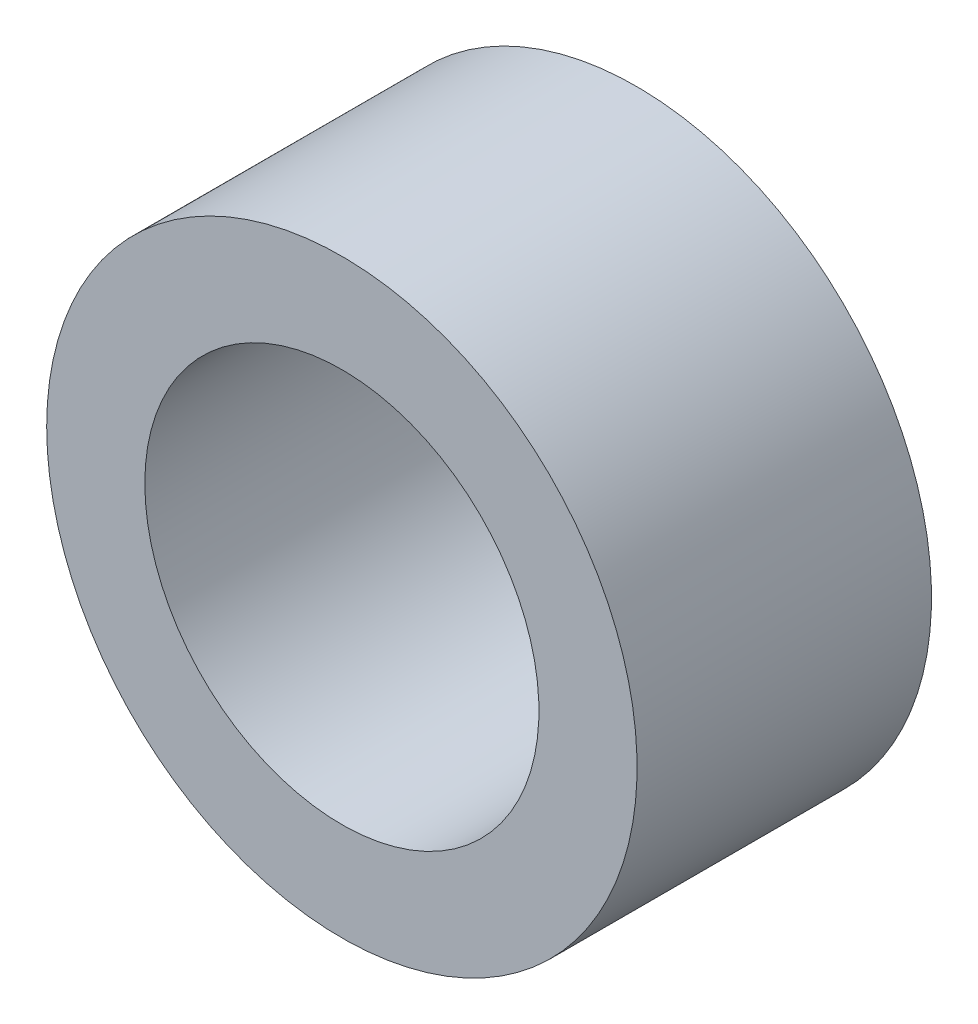
ISO-10303-21;
HEADER;
FILE_DESCRIPTION(('STEP AP214'),'2;1');
FILE_NAME('part.step','',(''),(''),'','','');
FILE_SCHEMA(('AUTOMOTIVE_DESIGN { 1 0 10303 214 1 1 1 1 }'));
ENDSEC;
DATA;
#1=APPLICATION_CONTEXT('core data for automotive mechanical design processes');
#2=APPLICATION_PROTOCOL_DEFINITION('international standard','automotive_design',2000,#1);
#3=PRODUCT_CONTEXT('',#1,'mechanical');
#4=PRODUCT('Part','Part','',(#3));
#5=PRODUCT_RELATED_PRODUCT_CATEGORY('part','',(#4));
#6=PRODUCT_DEFINITION_FORMATION('','',#4);
#7=PRODUCT_DEFINITION_CONTEXT('part definition',#1,'design');
#8=PRODUCT_DEFINITION('design','',#6,#7);
#9=PRODUCT_DEFINITION_SHAPE('','',#8);
#10=(LENGTH_UNIT() NAMED_UNIT(*) SI_UNIT(.MILLI.,.METRE.));
#11=(NAMED_UNIT(*) PLANE_ANGLE_UNIT() SI_UNIT($,.RADIAN.));
#12=(NAMED_UNIT(*) SI_UNIT($,.STERADIAN.) SOLID_ANGLE_UNIT());
#13=UNCERTAINTY_MEASURE_WITH_UNIT(LENGTH_MEASURE(1.E-05),#10,'distance_accuracy_value','');
#14=(GEOMETRIC_REPRESENTATION_CONTEXT(3) GLOBAL_UNCERTAINTY_ASSIGNED_CONTEXT((#13)) GLOBAL_UNIT_ASSIGNED_CONTEXT((#10,
#11,#12)) REPRESENTATION_CONTEXT('',''));
#15=CARTESIAN_POINT('',(0.,0.,0.));
#16=DIRECTION('',(0.,0.,1.));
#17=DIRECTION('',(1.,0.,0.));
#18=AXIS2_PLACEMENT_3D('',#15,#16,#17);
#19=CARTESIAN_POINT('',(0.,0.,4.7625));
#20=DIRECTION('',(0.,0.,1.));
#21=DIRECTION('',(1.,0.,0.));
#22=AXIS2_PLACEMENT_3D('',#19,#20,#21);
#23=PLANE('',#22);
#24=CARTESIAN_POINT('',(0.,0.,4.7625));
#25=DIRECTION('',(0.,0.,1.));
#26=DIRECTION('',(1.,0.,0.));
#27=AXIS2_PLACEMENT_3D('',#24,#25,#26);
#28=CIRCLE('',#27,9.5504);
#29=CARTESIAN_POINT('',(-9.5504,0.,4.7625));
#30=VERTEX_POINT('',#29);
#31=EDGE_CURVE('E10',#30,#30,#28,.T.);
#32=ORIENTED_EDGE('',*,*,#31,.T.);
#33=EDGE_LOOP('',(#32));
#34=FACE_BOUND('',#33,.T.);
#35=CARTESIAN_POINT('',(0.,0.,4.7625));
#36=DIRECTION('',(0.,0.,1.));
#37=DIRECTION('',(1.,0.,0.));
#38=AXIS2_PLACEMENT_3D('',#35,#36,#37);
#39=CIRCLE('',#38,6.3754);
#40=CARTESIAN_POINT('',(-6.3754,0.,4.7625));
#41=VERTEX_POINT('',#40);
#42=EDGE_CURVE('E41',#41,#41,#39,.T.);
#43=ORIENTED_EDGE('',*,*,#42,.F.);
#44=EDGE_LOOP('',(#43));
#45=FACE_BOUND('',#44,.T.);
#46=ADVANCED_FACE('F30',(#34,#45),#23,.T.);
#47=CARTESIAN_POINT('',(0.,0.,-4.7625));
#48=DIRECTION('',(0.,0.,1.));
#49=DIRECTION('',(1.,0.,0.));
#50=AXIS2_PLACEMENT_3D('',#47,#48,#49);
#51=PLANE('',#50);
#52=CARTESIAN_POINT('',(0.,0.,-4.7625));
#53=DIRECTION('',(0.,0.,1.));
#54=DIRECTION('',(1.,0.,0.));
#55=AXIS2_PLACEMENT_3D('',#52,#53,#54);
#56=CIRCLE('',#55,9.5504);
#57=CARTESIAN_POINT('',(-9.5504,0.,-4.7625));
#58=VERTEX_POINT('',#57);
#59=EDGE_CURVE('E34',#58,#58,#56,.T.);
#60=ORIENTED_EDGE('',*,*,#59,.F.);
#61=EDGE_LOOP('',(#60));
#62=FACE_BOUND('',#61,.T.);
#63=CARTESIAN_POINT('',(0.,0.,-4.7625));
#64=DIRECTION('',(0.,0.,1.));
#65=DIRECTION('',(1.,0.,0.));
#66=AXIS2_PLACEMENT_3D('',#63,#64,#65);
#67=CIRCLE('',#66,6.3754);
#68=CARTESIAN_POINT('',(-6.3754,0.,-4.7625));
#69=VERTEX_POINT('',#68);
#70=EDGE_CURVE('E43',#69,#69,#67,.T.);
#71=ORIENTED_EDGE('',*,*,#70,.T.);
#72=EDGE_LOOP('',(#71));
#73=FACE_BOUND('',#72,.T.);
#74=ADVANCED_FACE('F53',(#62,#73),#51,.F.);
#75=CARTESIAN_POINT('',(0.,0.,4.7625));
#76=DIRECTION('',(0.,0.,-1.));
#77=DIRECTION('',(-1.,0.,0.));
#78=AXIS2_PLACEMENT_3D('',#75,#76,#77);
#79=CYLINDRICAL_SURFACE('',#78,9.5504);
#80=CARTESIAN_POINT('',(-9.5504,0.,4.7625));
#81=CARTESIAN_POINT('',(-9.5504,0.,4.66328125));
#82=CARTESIAN_POINT('',(-9.5504,0.,4.5640625));
#83=CARTESIAN_POINT('',(-9.5504,0.,4.365625));
#84=CARTESIAN_POINT('',(-9.5504,0.,4.26640625));
#85=CARTESIAN_POINT('',(-9.5504,0.,4.06796875));
#86=CARTESIAN_POINT('',(-9.5504,0.,3.96875));
#87=CARTESIAN_POINT('',(-9.5504,0.,3.7703125));
#88=CARTESIAN_POINT('',(-9.5504,0.,3.67109375));
#89=CARTESIAN_POINT('',(-9.5504,0.,3.47265625));
#90=CARTESIAN_POINT('',(-9.5504,0.,3.3734375));
#91=CARTESIAN_POINT('',(-9.5504,0.,3.175));
#92=CARTESIAN_POINT('',(-9.5504,0.,3.07578125));
#93=CARTESIAN_POINT('',(-9.5504,0.,2.87734375));
#94=CARTESIAN_POINT('',(-9.5504,0.,2.778125));
#95=CARTESIAN_POINT('',(-9.5504,0.,2.5796875));
#96=CARTESIAN_POINT('',(-9.5504,0.,2.48046875));
#97=CARTESIAN_POINT('',(-9.5504,0.,2.28203125));
#98=CARTESIAN_POINT('',(-9.5504,0.,2.1828125));
#99=CARTESIAN_POINT('',(-9.5504,0.,1.984375));
#100=CARTESIAN_POINT('',(-9.5504,0.,1.88515625));
#101=CARTESIAN_POINT('',(-9.5504,0.,1.68671875));
#102=CARTESIAN_POINT('',(-9.5504,0.,1.5875));
#103=CARTESIAN_POINT('',(-9.5504,0.,1.3890625));
#104=CARTESIAN_POINT('',(-9.5504,0.,1.28984375));
#105=CARTESIAN_POINT('',(-9.5504,0.,1.09140625));
#106=CARTESIAN_POINT('',(-9.5504,0.,0.992187499999999));
#107=CARTESIAN_POINT('',(-9.5504,0.,0.793749999999999));
#108=CARTESIAN_POINT('',(-9.5504,0.,0.694531249999999));
#109=CARTESIAN_POINT('',(-9.5504,0.,0.496093749999999));
#110=CARTESIAN_POINT('',(-9.5504,0.,0.396874999999999));
#111=CARTESIAN_POINT('',(-9.5504,0.,0.198437499999999));
#112=CARTESIAN_POINT('',(-9.5504,0.,0.0992187499999992));
#113=CARTESIAN_POINT('',(-9.5504,0.,-0.0992187500000009));
#114=CARTESIAN_POINT('',(-9.5504,0.,-0.198437500000001));
#115=CARTESIAN_POINT('',(-9.5504,0.,-0.396875000000001));
#116=CARTESIAN_POINT('',(-9.5504,0.,-0.496093750000001));
#117=CARTESIAN_POINT('',(-9.5504,0.,-0.694531250000001));
#118=CARTESIAN_POINT('',(-9.5504,0.,-0.793750000000001));
#119=CARTESIAN_POINT('',(-9.5504,0.,-0.992187500000002));
#120=CARTESIAN_POINT('',(-9.5504,0.,-1.09140625));
#121=CARTESIAN_POINT('',(-9.5504,0.,-1.28984375));
#122=CARTESIAN_POINT('',(-9.5504,0.,-1.3890625));
#123=CARTESIAN_POINT('',(-9.5504,0.,-1.5875));
#124=CARTESIAN_POINT('',(-9.5504,0.,-1.68671875));
#125=CARTESIAN_POINT('',(-9.5504,0.,-1.88515625));
#126=CARTESIAN_POINT('',(-9.5504,0.,-1.984375));
#127=CARTESIAN_POINT('',(-9.5504,0.,-2.1828125));
#128=CARTESIAN_POINT('',(-9.5504,0.,-2.28203125));
#129=CARTESIAN_POINT('',(-9.5504,0.,-2.48046875));
#130=CARTESIAN_POINT('',(-9.5504,0.,-2.5796875));
#131=CARTESIAN_POINT('',(-9.5504,0.,-2.778125));
#132=CARTESIAN_POINT('',(-9.5504,0.,-2.87734375));
#133=CARTESIAN_POINT('',(-9.5504,0.,-3.07578125));
#134=CARTESIAN_POINT('',(-9.5504,0.,-3.175));
#135=CARTESIAN_POINT('',(-9.5504,0.,-3.3734375));
#136=CARTESIAN_POINT('',(-9.5504,0.,-3.47265625));
#137=CARTESIAN_POINT('',(-9.5504,0.,-3.67109375));
#138=CARTESIAN_POINT('',(-9.5504,0.,-3.7703125));
#139=CARTESIAN_POINT('',(-9.5504,0.,-3.96875));
#140=CARTESIAN_POINT('',(-9.5504,0.,-4.06796875));
#141=CARTESIAN_POINT('',(-9.5504,0.,-4.26640625));
#142=CARTESIAN_POINT('',(-9.5504,0.,-4.365625));
#143=CARTESIAN_POINT('',(-9.5504,0.,-4.5640625));
#144=CARTESIAN_POINT('',(-9.5504,0.,-4.66328125));
#145=CARTESIAN_POINT('',(-9.5504,0.,-4.7625));
#146=B_SPLINE_CURVE_WITH_KNOTS('',3,(#80,#81,#82,#83,#84,#85,#86,#87,#88,#89,#90,#91,#92,#93,
#94,#95,#96,#97,#98,#99,#100,#101,#102,#103,#104,#105,#106,#107,#108,#109,#110,#111,#112,#113,
#114,#115,#116,#117,#118,#119,#120,#121,#122,#123,#124,#125,#126,#127,#128,#129,#130,#131,#132,
#133,#134,#135,#136,#137,#138,#139,#140,#141,#142,#143,#144,#145),.UNSPECIFIED.,.F.,.F.,(4,2,2,
2,2,2,2,2,2,2,2,2,2,2,2,2,2,2,2,2,2,2,2,2,2,2,2,2,2,2,2,2,4),(0.,0.297656249999999,
0.595312499999999,0.89296875,1.190625,1.48828125,1.7859375,2.08359375,2.38125,2.67890625,
2.9765625,3.27421875,3.571875,3.86953125,4.1671875,4.46484375,4.7625,5.06015625,5.3578125,
5.65546875,5.953125,6.25078125,6.5484375,6.84609375,7.14375,7.44140625,7.7390625,8.03671875,
8.334375,8.63203125,8.9296875,9.22734375,9.525),.UNSPECIFIED.);
#147=EDGE_CURVE('BSEAM32',#30,#58,#146,.T.);
#148=ORIENTED_EDGE('',*,*,#31,.F.);
#149=ORIENTED_EDGE('',*,*,#59,.T.);
#150=ORIENTED_EDGE('',*,*,#147,.T.);
#151=ORIENTED_EDGE('',*,*,#147,.F.);
#152=EDGE_LOOP('',(#148,#150,#149,#151));
#153=FACE_BOUND('',#152,.T.);
#154=ADVANCED_FACE('F32',(#153),#79,.T.);
#155=CARTESIAN_POINT('',(0.,0.,4.7625));
#156=DIRECTION('',(0.,0.,-1.));
#157=DIRECTION('',(-1.,0.,0.));
#158=AXIS2_PLACEMENT_3D('',#155,#156,#157);
#159=CYLINDRICAL_SURFACE('',#158,6.3754);
#160=CARTESIAN_POINT('',(-6.3754,0.,4.7625));
#161=CARTESIAN_POINT('',(-6.3754,0.,4.66328125));
#162=CARTESIAN_POINT('',(-6.3754,0.,4.5640625));
#163=CARTESIAN_POINT('',(-6.3754,0.,4.365625));
#164=CARTESIAN_POINT('',(-6.3754,0.,4.26640625));
#165=CARTESIAN_POINT('',(-6.3754,0.,4.06796875));
#166=CARTESIAN_POINT('',(-6.3754,0.,3.96875));
#167=CARTESIAN_POINT('',(-6.3754,0.,3.7703125));
#168=CARTESIAN_POINT('',(-6.3754,0.,3.67109375));
#169=CARTESIAN_POINT('',(-6.3754,0.,3.47265625));
#170=CARTESIAN_POINT('',(-6.3754,0.,3.3734375));
#171=CARTESIAN_POINT('',(-6.3754,0.,3.175));
#172=CARTESIAN_POINT('',(-6.3754,0.,3.07578125));
#173=CARTESIAN_POINT('',(-6.3754,0.,2.87734375));
#174=CARTESIAN_POINT('',(-6.3754,0.,2.778125));
#175=CARTESIAN_POINT('',(-6.3754,0.,2.5796875));
#176=CARTESIAN_POINT('',(-6.3754,0.,2.48046875));
#177=CARTESIAN_POINT('',(-6.3754,0.,2.28203125));
#178=CARTESIAN_POINT('',(-6.3754,0.,2.1828125));
#179=CARTESIAN_POINT('',(-6.3754,0.,1.984375));
#180=CARTESIAN_POINT('',(-6.3754,0.,1.88515625));
#181=CARTESIAN_POINT('',(-6.3754,0.,1.68671875));
#182=CARTESIAN_POINT('',(-6.3754,0.,1.5875));
#183=CARTESIAN_POINT('',(-6.3754,0.,1.3890625));
#184=CARTESIAN_POINT('',(-6.3754,0.,1.28984375));
#185=CARTESIAN_POINT('',(-6.3754,0.,1.09140625));
#186=CARTESIAN_POINT('',(-6.3754,0.,0.992187499999999));
#187=CARTESIAN_POINT('',(-6.3754,0.,0.793749999999999));
#188=CARTESIAN_POINT('',(-6.3754,0.,0.694531249999999));
#189=CARTESIAN_POINT('',(-6.3754,0.,0.496093749999999));
#190=CARTESIAN_POINT('',(-6.3754,0.,0.396874999999999));
#191=CARTESIAN_POINT('',(-6.3754,0.,0.198437499999999));
#192=CARTESIAN_POINT('',(-6.3754,0.,0.0992187499999992));
#193=CARTESIAN_POINT('',(-6.3754,0.,-0.0992187500000009));
#194=CARTESIAN_POINT('',(-6.3754,0.,-0.198437500000001));
#195=CARTESIAN_POINT('',(-6.3754,0.,-0.396875000000001));
#196=CARTESIAN_POINT('',(-6.3754,0.,-0.496093750000001));
#197=CARTESIAN_POINT('',(-6.3754,0.,-0.694531250000001));
#198=CARTESIAN_POINT('',(-6.3754,0.,-0.793750000000001));
#199=CARTESIAN_POINT('',(-6.3754,0.,-0.992187500000002));
#200=CARTESIAN_POINT('',(-6.3754,0.,-1.09140625));
#201=CARTESIAN_POINT('',(-6.3754,0.,-1.28984375));
#202=CARTESIAN_POINT('',(-6.3754,0.,-1.3890625));
#203=CARTESIAN_POINT('',(-6.3754,0.,-1.5875));
#204=CARTESIAN_POINT('',(-6.3754,0.,-1.68671875));
#205=CARTESIAN_POINT('',(-6.3754,0.,-1.88515625));
#206=CARTESIAN_POINT('',(-6.3754,0.,-1.984375));
#207=CARTESIAN_POINT('',(-6.3754,0.,-2.1828125));
#208=CARTESIAN_POINT('',(-6.3754,0.,-2.28203125));
#209=CARTESIAN_POINT('',(-6.3754,0.,-2.48046875));
#210=CARTESIAN_POINT('',(-6.3754,0.,-2.5796875));
#211=CARTESIAN_POINT('',(-6.3754,0.,-2.778125));
#212=CARTESIAN_POINT('',(-6.3754,0.,-2.87734375));
#213=CARTESIAN_POINT('',(-6.3754,0.,-3.07578125));
#214=CARTESIAN_POINT('',(-6.3754,0.,-3.175));
#215=CARTESIAN_POINT('',(-6.3754,0.,-3.3734375));
#216=CARTESIAN_POINT('',(-6.3754,0.,-3.47265625));
#217=CARTESIAN_POINT('',(-6.3754,0.,-3.67109375));
#218=CARTESIAN_POINT('',(-6.3754,0.,-3.7703125));
#219=CARTESIAN_POINT('',(-6.3754,0.,-3.96875));
#220=CARTESIAN_POINT('',(-6.3754,0.,-4.06796875));
#221=CARTESIAN_POINT('',(-6.3754,0.,-4.26640625));
#222=CARTESIAN_POINT('',(-6.3754,0.,-4.365625));
#223=CARTESIAN_POINT('',(-6.3754,0.,-4.5640625));
#224=CARTESIAN_POINT('',(-6.3754,0.,-4.66328125));
#225=CARTESIAN_POINT('',(-6.3754,0.,-4.7625));
#226=B_SPLINE_CURVE_WITH_KNOTS('',3,(#160,#161,#162,#163,#164,#165,#166,#167,#168,#169,#170,
#171,#172,#173,#174,#175,#176,#177,#178,#179,#180,#181,#182,#183,#184,#185,#186,#187,#188,#189,
#190,#191,#192,#193,#194,#195,#196,#197,#198,#199,#200,#201,#202,#203,#204,#205,#206,#207,#208,
#209,#210,#211,#212,#213,#214,#215,#216,#217,#218,#219,#220,#221,#222,#223,#224,#225),
.UNSPECIFIED.,.F.,.F.,(4,2,2,2,2,2,2,2,2,2,2,2,2,2,2,2,2,2,2,2,2,2,2,2,2,2,2,2,2,2,2,2,4),(0.,
0.297656249999999,0.595312499999999,0.89296875,1.190625,1.48828125,1.7859375,2.08359375,2.38125,
2.67890625,2.9765625,3.27421875,3.571875,3.86953125,4.1671875,4.46484375,4.7625,5.06015625,
5.3578125,5.65546875,5.953125,6.25078125,6.5484375,6.84609375,7.14375,7.44140625,7.7390625,
8.03671875,8.334375,8.63203125,8.9296875,9.22734375,9.525),.UNSPECIFIED.);
#227=EDGE_CURVE('BSEAM49',#41,#69,#226,.T.);
#228=ORIENTED_EDGE('',*,*,#42,.T.);
#229=ORIENTED_EDGE('',*,*,#70,.F.);
#230=ORIENTED_EDGE('',*,*,#227,.T.);
#231=ORIENTED_EDGE('',*,*,#227,.F.);
#232=EDGE_LOOP('',(#228,#230,#229,#231));
#233=FACE_BOUND('',#232,.T.);
#234=ADVANCED_FACE('F49',(#233),#159,.F.);
#235=CLOSED_SHELL('',(#46,#74,#154,#234));
#236=MANIFOLD_SOLID_BREP('B2',#235);
#237=ADVANCED_BREP_SHAPE_REPRESENTATION('',(#18,#236),#14);
#238=SHAPE_DEFINITION_REPRESENTATION(#9,#237);
ENDSEC;
END-ISO-10303-21;
